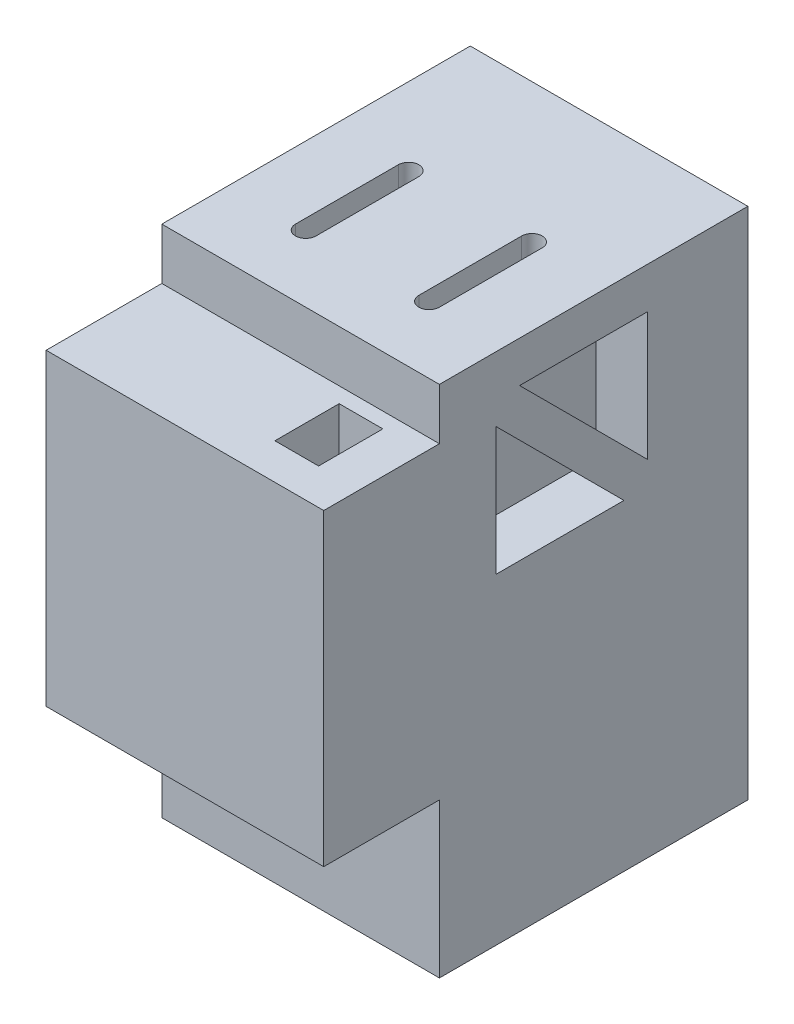
ISO-10303-21;
HEADER;
FILE_DESCRIPTION(('STEP AP214'),'2;1');
FILE_NAME('part.step','',(''),(''),'','','');
FILE_SCHEMA(('AUTOMOTIVE_DESIGN { 1 0 10303 214 1 1 1 1 }'));
ENDSEC;
DATA;
#1=APPLICATION_CONTEXT('core data for automotive mechanical design processes');
#2=APPLICATION_PROTOCOL_DEFINITION('international standard','automotive_design',2000,#1);
#3=PRODUCT_CONTEXT('',#1,'mechanical');
#4=PRODUCT('Part','Part','',(#3));
#5=PRODUCT_RELATED_PRODUCT_CATEGORY('part','',(#4));
#6=PRODUCT_DEFINITION_FORMATION('','',#4);
#7=PRODUCT_DEFINITION_CONTEXT('part definition',#1,'design');
#8=PRODUCT_DEFINITION('design','',#6,#7);
#9=PRODUCT_DEFINITION_SHAPE('','',#8);
#10=(LENGTH_UNIT() NAMED_UNIT(*) SI_UNIT(.MILLI.,.METRE.));
#11=(NAMED_UNIT(*) PLANE_ANGLE_UNIT() SI_UNIT($,.RADIAN.));
#12=(NAMED_UNIT(*) SI_UNIT($,.STERADIAN.) SOLID_ANGLE_UNIT());
#13=UNCERTAINTY_MEASURE_WITH_UNIT(LENGTH_MEASURE(1.E-05),#10,'distance_accuracy_value','');
#14=(GEOMETRIC_REPRESENTATION_CONTEXT(3) GLOBAL_UNCERTAINTY_ASSIGNED_CONTEXT((#13)) GLOBAL_UNIT_ASSIGNED_CONTEXT((#10,
#11,#12)) REPRESENTATION_CONTEXT('',''));
#15=CARTESIAN_POINT('',(0.,0.,0.));
#16=DIRECTION('',(0.,0.,1.));
#17=DIRECTION('',(1.,0.,0.));
#18=AXIS2_PLACEMENT_3D('',#15,#16,#17);
#19=CARTESIAN_POINT('',(0.,0.,60.));
#20=DIRECTION('',(0.,0.,1.));
#21=DIRECTION('',(1.,0.,0.));
#22=AXIS2_PLACEMENT_3D('',#19,#20,#21);
#23=PLANE('',#22);
#24=DIRECTION('',(-1.,0.,0.));
#25=VECTOR('',#24,1.);
#26=CARTESIAN_POINT('',(-54.,-10.,60.));
#27=LINE('',#26,#25);
#28=CARTESIAN_POINT('',(0.,-10.,60.));
#29=VERTEX_POINT('',#28);
#30=CARTESIAN_POINT('',(-54.,-10.,60.));
#31=VERTEX_POINT('',#30);
#32=EDGE_CURVE('E359',#29,#31,#27,.T.);
#33=ORIENTED_EDGE('',*,*,#32,.F.);
#34=DIRECTION('',(0.,1.,0.));
#35=VECTOR('',#34,1.);
#36=CARTESIAN_POINT('',(0.,0.,60.));
#37=LINE('',#36,#35);
#38=CARTESIAN_POINT('',(0.,0.,60.));
#39=VERTEX_POINT('',#38);
#40=EDGE_CURVE('E387',#29,#39,#37,.T.);
#41=ORIENTED_EDGE('',*,*,#40,.T.);
#42=DIRECTION('',(-1.,0.,0.));
#43=VECTOR('',#42,1.);
#44=CARTESIAN_POINT('',(-54.,0.,60.));
#45=LINE('',#44,#43);
#46=CARTESIAN_POINT('',(-54.,0.,60.));
#47=VERTEX_POINT('',#46);
#48=EDGE_CURVE('E390',#39,#47,#45,.T.);
#49=ORIENTED_EDGE('',*,*,#48,.T.);
#50=DIRECTION('',(0.,-1.,0.));
#51=VECTOR('',#50,1.);
#52=CARTESIAN_POINT('',(-54.,0.,60.));
#53=LINE('',#52,#51);
#54=EDGE_CURVE('E382',#47,#31,#53,.T.);
#55=ORIENTED_EDGE('',*,*,#54,.T.);
#56=EDGE_LOOP('',(#33,#41,#49,#55));
#57=FACE_BOUND('',#56,.T.);
#58=ADVANCED_FACE('F34',(#57),#23,.T.);
#59=CARTESIAN_POINT('',(-54.,0.,60.));
#60=DIRECTION('',(1.,0.,0.));
#61=DIRECTION('',(0.,1.,0.));
#62=AXIS2_PLACEMENT_3D('',#59,#60,#61);
#63=PLANE('',#62);
#64=DIRECTION('',(0.,-1.,0.));
#65=VECTOR('',#64,1.);
#66=CARTESIAN_POINT('',(-54.,0.,0.));
#67=LINE('',#66,#65);
#68=CARTESIAN_POINT('',(-54.,0.,0.));
#69=VERTEX_POINT('',#68);
#70=CARTESIAN_POINT('',(-54.,-100.,0.));
#71=VERTEX_POINT('',#70);
#72=EDGE_CURVE('E381',#69,#71,#67,.T.);
#73=ORIENTED_EDGE('',*,*,#72,.T.);
#74=DIRECTION('',(0.,0.,-1.));
#75=VECTOR('',#74,1.);
#76=CARTESIAN_POINT('',(-54.,-100.,60.));
#77=LINE('',#76,#75);
#78=CARTESIAN_POINT('',(-54.,-100.,60.));
#79=VERTEX_POINT('',#78);
#80=EDGE_CURVE('E11',#79,#71,#77,.T.);
#81=ORIENTED_EDGE('',*,*,#80,.F.);
#82=CARTESIAN_POINT('',(-54.,-70.,60.));
#83=VERTEX_POINT('',#82);
#84=EDGE_CURVE('E385',#83,#79,#53,.T.);
#85=ORIENTED_EDGE('',*,*,#84,.F.);
#86=DIRECTION('',(0.,0.,-1.));
#87=VECTOR('',#86,1.);
#88=CARTESIAN_POINT('',(-54.,-70.,82.5));
#89=LINE('',#88,#87);
#90=CARTESIAN_POINT('',(-54.,-70.,82.5));
#91=VERTEX_POINT('',#90);
#92=EDGE_CURVE('E378',#91,#83,#89,.T.);
#93=ORIENTED_EDGE('',*,*,#92,.F.);
#94=DIRECTION('',(0.,-1.,0.));
#95=VECTOR('',#94,1.);
#96=CARTESIAN_POINT('',(-54.,-70.,82.5));
#97=LINE('',#96,#95);
#98=CARTESIAN_POINT('',(-54.,-10.,82.5));
#99=VERTEX_POINT('',#98);
#100=EDGE_CURVE('E355',#99,#91,#97,.T.);
#101=ORIENTED_EDGE('',*,*,#100,.F.);
#102=DIRECTION('',(0.,0.,-1.));
#103=VECTOR('',#102,1.);
#104=CARTESIAN_POINT('',(-54.,-10.,82.5));
#105=LINE('',#104,#103);
#106=EDGE_CURVE('E365',#99,#31,#105,.T.);
#107=ORIENTED_EDGE('',*,*,#106,.T.);
#108=ORIENTED_EDGE('',*,*,#54,.F.);
#109=DIRECTION('',(0.,0.,-1.));
#110=VECTOR('',#109,1.);
#111=CARTESIAN_POINT('',(-54.,0.,60.));
#112=LINE('',#111,#110);
#113=EDGE_CURVE('E392',#47,#69,#112,.T.);
#114=ORIENTED_EDGE('',*,*,#113,.T.);
#115=EDGE_LOOP('',(#73,#81,#85,#93,#101,#107,#108,#114));
#116=FACE_BOUND('',#115,.T.);
#117=ADVANCED_FACE('F36',(#116),#63,.F.);
#118=CARTESIAN_POINT('',(-54.,-100.,60.));
#119=DIRECTION('',(0.,1.,0.));
#120=DIRECTION('',(0.,0.,1.));
#121=AXIS2_PLACEMENT_3D('',#118,#119,#120);
#122=PLANE('',#121);
#123=DIRECTION('',(1.,0.,0.));
#124=VECTOR('',#123,1.);
#125=CARTESIAN_POINT('',(-54.,-100.,0.));
#126=LINE('',#125,#124);
#127=CARTESIAN_POINT('',(0.,-100.,0.));
#128=VERTEX_POINT('',#127);
#129=EDGE_CURVE('E395',#71,#128,#126,.T.);
#130=ORIENTED_EDGE('',*,*,#129,.T.);
#131=DIRECTION('',(0.,0.,-1.));
#132=VECTOR('',#131,1.);
#133=CARTESIAN_POINT('',(0.,-100.,60.));
#134=LINE('',#133,#132);
#135=CARTESIAN_POINT('',(0.,-100.,60.));
#136=VERTEX_POINT('',#135);
#137=EDGE_CURVE('E42',#136,#128,#134,.T.);
#138=ORIENTED_EDGE('',*,*,#137,.F.);
#139=DIRECTION('',(1.,0.,0.));
#140=VECTOR('',#139,1.);
#141=CARTESIAN_POINT('',(-54.,-100.,60.));
#142=LINE('',#141,#140);
#143=EDGE_CURVE('E384',#79,#136,#142,.T.);
#144=ORIENTED_EDGE('',*,*,#143,.F.);
#145=ORIENTED_EDGE('',*,*,#80,.T.);
#146=EDGE_LOOP('',(#130,#138,#144,#145));
#147=FACE_BOUND('',#146,.T.);
#148=ADVANCED_FACE('F443',(#147),#122,.F.);
#149=CARTESIAN_POINT('',(0.,0.,60.));
#150=DIRECTION('',(-1.,0.,0.));
#151=DIRECTION('',(0.,-1.,0.));
#152=AXIS2_PLACEMENT_3D('',#149,#150,#151);
#153=PLANE('',#152);
#154=DIRECTION('',(0.,0.707106781186548,0.707106781186547));
#155=VECTOR('',#154,1.);
#156=CARTESIAN_POINT('',(0.,-37.5,24.0961940777126));
#157=LINE('',#156,#155);
#158=CARTESIAN_POINT('',(0.,-37.5,24.0961940777126));
#159=VERTEX_POINT('',#158);
#160=CARTESIAN_POINT('',(0.,-12.5961940777126,49.));
#161=VERTEX_POINT('',#160);
#162=EDGE_CURVE('E227',#159,#161,#157,.T.);
#163=ORIENTED_EDGE('',*,*,#162,.F.);
#164=DIRECTION('',(0.,0.,-1.));
#165=VECTOR('',#164,1.);
#166=CARTESIAN_POINT('',(0.,-37.5,49.));
#167=LINE('',#166,#165);
#168=CARTESIAN_POINT('',(0.,-37.5,49.));
#169=VERTEX_POINT('',#168);
#170=EDGE_CURVE('E49',#169,#159,#167,.T.);
#171=ORIENTED_EDGE('',*,*,#170,.F.);
#172=DIRECTION('',(0.,-1.,0.));
#173=VECTOR('',#172,1.);
#174=CARTESIAN_POINT('',(0.,-12.5961940777126,49.));
#175=LINE('',#174,#173);
#176=EDGE_CURVE('E224',#161,#169,#175,.T.);
#177=ORIENTED_EDGE('',*,*,#176,.F.);
#178=EDGE_LOOP('',(#163,#171,#177));
#179=FACE_BOUND('',#178,.T.);
#180=DIRECTION('',(0.,1.,0.));
#181=VECTOR('',#180,1.);
#182=CARTESIAN_POINT('',(0.,-8.,19.5));
#183=LINE('',#182,#181);
#184=CARTESIAN_POINT('',(0.,-32.9038059222874,19.5));
#185=VERTEX_POINT('',#184);
#186=CARTESIAN_POINT('',(0.,-8.,19.5));
#187=VERTEX_POINT('',#186);
#188=EDGE_CURVE('E248',#185,#187,#183,.T.);
#189=ORIENTED_EDGE('',*,*,#188,.F.);
#190=DIRECTION('',(0.,-0.707106781186548,-0.707106781186548));
#191=VECTOR('',#190,1.);
#192=CARTESIAN_POINT('',(0.,-32.9038059222874,19.5));
#193=LINE('',#192,#191);
#194=CARTESIAN_POINT('',(0.,-8.,44.4038059222874));
#195=VERTEX_POINT('',#194);
#196=EDGE_CURVE('E57',#195,#185,#193,.T.);
#197=ORIENTED_EDGE('',*,*,#196,.F.);
#198=DIRECTION('',(0.,0.,1.));
#199=VECTOR('',#198,1.);
#200=CARTESIAN_POINT('',(0.,-8.,44.4038059222874));
#201=LINE('',#200,#199);
#202=EDGE_CURVE('E240',#187,#195,#201,.T.);
#203=ORIENTED_EDGE('',*,*,#202,.F.);
#204=EDGE_LOOP('',(#189,#197,#203));
#205=FACE_BOUND('',#204,.T.);
#206=DIRECTION('',(0.,1.,0.));
#207=VECTOR('',#206,1.);
#208=CARTESIAN_POINT('',(0.,0.,0.));
#209=LINE('',#208,#207);
#210=CARTESIAN_POINT('',(0.,0.,0.));
#211=VERTEX_POINT('',#210);
#212=EDGE_CURVE('E397',#128,#211,#209,.T.);
#213=ORIENTED_EDGE('',*,*,#212,.T.);
#214=DIRECTION('',(0.,0.,-1.));
#215=VECTOR('',#214,1.);
#216=CARTESIAN_POINT('',(0.,0.,60.));
#217=LINE('',#216,#215);
#218=EDGE_CURVE('E403',#39,#211,#217,.T.);
#219=ORIENTED_EDGE('',*,*,#218,.F.);
#220=ORIENTED_EDGE('',*,*,#40,.F.);
#221=DIRECTION('',(0.,0.,-1.));
#222=VECTOR('',#221,1.);
#223=CARTESIAN_POINT('',(0.,-10.,82.5));
#224=LINE('',#223,#222);
#225=CARTESIAN_POINT('',(0.,-10.,82.5));
#226=VERTEX_POINT('',#225);
#227=EDGE_CURVE('E372',#226,#29,#224,.T.);
#228=ORIENTED_EDGE('',*,*,#227,.F.);
#229=DIRECTION('',(0.,1.,0.));
#230=VECTOR('',#229,1.);
#231=CARTESIAN_POINT('',(0.,-10.,82.5));
#232=LINE('',#231,#230);
#233=CARTESIAN_POINT('',(0.,-70.,82.5));
#234=VERTEX_POINT('',#233);
#235=EDGE_CURVE('E361',#234,#226,#232,.T.);
#236=ORIENTED_EDGE('',*,*,#235,.F.);
#237=DIRECTION('',(0.,0.,-1.));
#238=VECTOR('',#237,1.);
#239=CARTESIAN_POINT('',(0.,-70.,82.5));
#240=LINE('',#239,#238);
#241=CARTESIAN_POINT('',(0.,-70.,60.));
#242=VERTEX_POINT('',#241);
#243=EDGE_CURVE('E375',#234,#242,#240,.T.);
#244=ORIENTED_EDGE('',*,*,#243,.T.);
#245=EDGE_CURVE('E388',#136,#242,#37,.T.);
#246=ORIENTED_EDGE('',*,*,#245,.F.);
#247=ORIENTED_EDGE('',*,*,#137,.T.);
#248=EDGE_LOOP('',(#213,#219,#220,#228,#236,#244,#246,#247));
#249=FACE_BOUND('',#248,.T.);
#250=ADVANCED_FACE('F410',(#179,#205,#249),#153,.F.);
#251=CARTESIAN_POINT('',(-54.,0.,60.));
#252=DIRECTION('',(0.,-1.,0.));
#253=DIRECTION('',(0.,0.,-1.));
#254=AXIS2_PLACEMENT_3D('',#251,#252,#253);
#255=PLANE('',#254);
#256=DIRECTION('',(0.,0.,1.));
#257=VECTOR('',#256,1.);
#258=CARTESIAN_POINT('',(-41.,0.,27.));
#259=LINE('',#258,#257);
#260=CARTESIAN_POINT('',(-41.,0.,27.));
#261=VERTEX_POINT('',#260);
#262=CARTESIAN_POINT('',(-41.,0.,47.));
#263=VERTEX_POINT('',#262);
#264=EDGE_CURVE('E275',#261,#263,#259,.T.);
#265=ORIENTED_EDGE('',*,*,#264,.F.);
#266=CARTESIAN_POINT('',(-39.,0.,27.));
#267=DIRECTION('',(0.,1.,0.));
#268=DIRECTION('',(0.,0.,1.));
#269=AXIS2_PLACEMENT_3D('',#266,#267,#268);
#270=CIRCLE('',#269,2.);
#271=CARTESIAN_POINT('',(-37.,0.,27.));
#272=VERTEX_POINT('',#271);
#273=EDGE_CURVE('E273',#272,#261,#270,.T.);
#274=ORIENTED_EDGE('',*,*,#273,.F.);
#275=DIRECTION('',(0.,0.,-1.));
#276=VECTOR('',#275,1.);
#277=CARTESIAN_POINT('',(-37.,0.,27.));
#278=LINE('',#277,#276);
#279=CARTESIAN_POINT('',(-37.,0.,47.));
#280=VERTEX_POINT('',#279);
#281=EDGE_CURVE('E263',#280,#272,#278,.T.);
#282=ORIENTED_EDGE('',*,*,#281,.F.);
#283=CARTESIAN_POINT('',(-39.,0.,47.));
#284=DIRECTION('',(0.,1.,0.));
#285=DIRECTION('',(0.,0.,1.));
#286=AXIS2_PLACEMENT_3D('',#283,#284,#285);
#287=CIRCLE('',#286,2.00000000000001);
#288=EDGE_CURVE('E279',#263,#280,#287,.T.);
#289=ORIENTED_EDGE('',*,*,#288,.F.);
#290=EDGE_LOOP('',(#265,#274,#282,#289));
#291=FACE_BOUND('',#290,.T.);
#292=DIRECTION('',(0.,0.,1.));
#293=VECTOR('',#292,1.);
#294=CARTESIAN_POINT('',(-17.,0.,27.));
#295=LINE('',#294,#293);
#296=CARTESIAN_POINT('',(-17.,0.,27.));
#297=VERTEX_POINT('',#296);
#298=CARTESIAN_POINT('',(-17.,0.,47.));
#299=VERTEX_POINT('',#298);
#300=EDGE_CURVE('E308',#297,#299,#295,.T.);
#301=ORIENTED_EDGE('',*,*,#300,.F.);
#302=CARTESIAN_POINT('',(-15.,0.,27.));
#303=DIRECTION('',(0.,1.,0.));
#304=DIRECTION('',(0.,0.,-1.));
#305=AXIS2_PLACEMENT_3D('',#302,#303,#304);
#306=CIRCLE('',#305,2.);
#307=CARTESIAN_POINT('',(-13.,0.,27.));
#308=VERTEX_POINT('',#307);
#309=EDGE_CURVE('E255',#308,#297,#306,.T.);
#310=ORIENTED_EDGE('',*,*,#309,.F.);
#311=DIRECTION('',(0.,0.,-1.));
#312=VECTOR('',#311,1.);
#313=CARTESIAN_POINT('',(-13.,0.,27.));
#314=LINE('',#313,#312);
#315=CARTESIAN_POINT('',(-13.,0.,47.));
#316=VERTEX_POINT('',#315);
#317=EDGE_CURVE('E297',#316,#308,#314,.T.);
#318=ORIENTED_EDGE('',*,*,#317,.F.);
#319=CARTESIAN_POINT('',(-15.,0.,47.));
#320=DIRECTION('',(0.,1.,0.));
#321=DIRECTION('',(0.,0.,-1.));
#322=AXIS2_PLACEMENT_3D('',#319,#320,#321);
#323=CIRCLE('',#322,2.00000000000001);
#324=EDGE_CURVE('E311',#299,#316,#323,.T.);
#325=ORIENTED_EDGE('',*,*,#324,.F.);
#326=EDGE_LOOP('',(#301,#310,#318,#325));
#327=FACE_BOUND('',#326,.T.);
#328=DIRECTION('',(-1.,0.,0.));
#329=VECTOR('',#328,1.);
#330=CARTESIAN_POINT('',(-54.,0.,0.));
#331=LINE('',#330,#329);
#332=EDGE_CURVE('E399',#211,#69,#331,.T.);
#333=ORIENTED_EDGE('',*,*,#332,.T.);
#334=ORIENTED_EDGE('',*,*,#113,.F.);
#335=ORIENTED_EDGE('',*,*,#48,.F.);
#336=ORIENTED_EDGE('',*,*,#218,.T.);
#337=EDGE_LOOP('',(#333,#334,#335,#336));
#338=FACE_BOUND('',#337,.T.);
#339=ADVANCED_FACE('F420',(#291,#327,#338),#255,.F.);
#340=DIRECTION('',(1.,0.,0.));
#341=VECTOR('',#340,1.);
#342=CARTESIAN_POINT('',(0.,-70.,60.));
#343=LINE('',#342,#341);
#344=EDGE_CURVE('E348',#83,#242,#343,.T.);
#345=ORIENTED_EDGE('',*,*,#344,.F.);
#346=ORIENTED_EDGE('',*,*,#84,.T.);
#347=ORIENTED_EDGE('',*,*,#143,.T.);
#348=ORIENTED_EDGE('',*,*,#245,.T.);
#349=EDGE_LOOP('',(#345,#346,#347,#348));
#350=FACE_BOUND('',#349,.T.);
#351=ADVANCED_FACE('F442',(#350),#23,.T.);
#352=CARTESIAN_POINT('',(0.,0.,0.));
#353=DIRECTION('',(0.,0.,1.));
#354=DIRECTION('',(1.,0.,0.));
#355=AXIS2_PLACEMENT_3D('',#352,#353,#354);
#356=PLANE('',#355);
#357=ORIENTED_EDGE('',*,*,#72,.F.);
#358=ORIENTED_EDGE('',*,*,#332,.F.);
#359=ORIENTED_EDGE('',*,*,#212,.F.);
#360=ORIENTED_EDGE('',*,*,#129,.F.);
#361=EDGE_LOOP('',(#357,#358,#359,#360));
#362=FACE_BOUND('',#361,.T.);
#363=ADVANCED_FACE('F417',(#362),#356,.F.);
#364=CARTESIAN_POINT('',(0.,-70.,82.5));
#365=DIRECTION('',(0.,1.,0.));
#366=DIRECTION('',(0.,0.,1.));
#367=AXIS2_PLACEMENT_3D('',#364,#365,#366);
#368=PLANE('',#367);
#369=ORIENTED_EDGE('',*,*,#344,.T.);
#370=ORIENTED_EDGE('',*,*,#243,.F.);
#371=DIRECTION('',(1.,0.,0.));
#372=VECTOR('',#371,1.);
#373=CARTESIAN_POINT('',(0.,-70.,82.5));
#374=LINE('',#373,#372);
#375=EDGE_CURVE('E358',#91,#234,#374,.T.);
#376=ORIENTED_EDGE('',*,*,#375,.F.);
#377=ORIENTED_EDGE('',*,*,#92,.T.);
#378=EDGE_LOOP('',(#369,#370,#376,#377));
#379=FACE_BOUND('',#378,.T.);
#380=ADVANCED_FACE('F439',(#379),#368,.F.);
#381=CARTESIAN_POINT('',(-54.,-10.,82.5));
#382=DIRECTION('',(0.,-1.,0.));
#383=DIRECTION('',(0.,0.,-1.));
#384=AXIS2_PLACEMENT_3D('',#381,#382,#383);
#385=PLANE('',#384);
#386=DIRECTION('',(-1.,0.,0.));
#387=VECTOR('',#386,1.);
#388=CARTESIAN_POINT('',(-16.5,-10.,63.));
#389=LINE('',#388,#387);
#390=CARTESIAN_POINT('',(-7.99999999999999,-10.,63.));
#391=VERTEX_POINT('',#390);
#392=CARTESIAN_POINT('',(-16.5,-10.,63.));
#393=VERTEX_POINT('',#392);
#394=EDGE_CURVE('E338',#391,#393,#389,.T.);
#395=ORIENTED_EDGE('',*,*,#394,.F.);
#396=DIRECTION('',(0.,0.,-1.));
#397=VECTOR('',#396,1.);
#398=CARTESIAN_POINT('',(-7.99999999999999,-10.,75.5));
#399=LINE('',#398,#397);
#400=CARTESIAN_POINT('',(-7.99999999999999,-10.,75.5));
#401=VERTEX_POINT('',#400);
#402=EDGE_CURVE('E286',#401,#391,#399,.T.);
#403=ORIENTED_EDGE('',*,*,#402,.F.);
#404=DIRECTION('',(1.,0.,0.));
#405=VECTOR('',#404,1.);
#406=CARTESIAN_POINT('',(-16.5,-10.,75.5));
#407=LINE('',#406,#405);
#408=CARTESIAN_POINT('',(-16.5,-10.,75.5));
#409=VERTEX_POINT('',#408);
#410=EDGE_CURVE('E327',#409,#401,#407,.T.);
#411=ORIENTED_EDGE('',*,*,#410,.F.);
#412=DIRECTION('',(0.,0.,1.));
#413=VECTOR('',#412,1.);
#414=CARTESIAN_POINT('',(-16.5,-10.,75.5));
#415=LINE('',#414,#413);
#416=EDGE_CURVE('E341',#393,#409,#415,.T.);
#417=ORIENTED_EDGE('',*,*,#416,.F.);
#418=EDGE_LOOP('',(#395,#403,#411,#417));
#419=FACE_BOUND('',#418,.T.);
#420=ORIENTED_EDGE('',*,*,#32,.T.);
#421=ORIENTED_EDGE('',*,*,#106,.F.);
#422=DIRECTION('',(-1.,0.,0.));
#423=VECTOR('',#422,1.);
#424=CARTESIAN_POINT('',(-54.,-10.,82.5));
#425=LINE('',#424,#423);
#426=EDGE_CURVE('E363',#226,#99,#425,.T.);
#427=ORIENTED_EDGE('',*,*,#426,.F.);
#428=ORIENTED_EDGE('',*,*,#227,.T.);
#429=EDGE_LOOP('',(#420,#421,#427,#428));
#430=FACE_BOUND('',#429,.T.);
#431=ADVANCED_FACE('F430',(#419,#430),#385,.F.);
#432=CARTESIAN_POINT('',(0.,0.,82.5));
#433=DIRECTION('',(0.,0.,-1.));
#434=DIRECTION('',(-1.,0.,0.));
#435=AXIS2_PLACEMENT_3D('',#432,#433,#434);
#436=PLANE('',#435);
#437=ORIENTED_EDGE('',*,*,#100,.T.);
#438=ORIENTED_EDGE('',*,*,#375,.T.);
#439=ORIENTED_EDGE('',*,*,#235,.T.);
#440=ORIENTED_EDGE('',*,*,#426,.T.);
#441=EDGE_LOOP('',(#437,#438,#439,#440));
#442=FACE_BOUND('',#441,.T.);
#443=ADVANCED_FACE('F436',(#442),#436,.F.);
#444=CARTESIAN_POINT('',(-7.99999999999999,-32.5,75.5));
#445=DIRECTION('',(1.,0.,0.));
#446=DIRECTION('',(0.,0.,-1.));
#447=AXIS2_PLACEMENT_3D('',#444,#445,#446);
#448=PLANE('',#447);
#449=ORIENTED_EDGE('',*,*,#402,.T.);
#450=DIRECTION('',(0.,1.,0.));
#451=VECTOR('',#450,1.);
#452=CARTESIAN_POINT('',(-7.99999999999999,-32.5,63.));
#453=LINE('',#452,#451);
#454=CARTESIAN_POINT('',(-7.99999999999999,-32.5,63.));
#455=VERTEX_POINT('',#454);
#456=EDGE_CURVE('E336',#455,#391,#453,.T.);
#457=ORIENTED_EDGE('',*,*,#456,.F.);
#458=DIRECTION('',(0.,0.,-1.));
#459=VECTOR('',#458,1.);
#460=CARTESIAN_POINT('',(-7.99999999999999,-32.5,75.5));
#461=LINE('',#460,#459);
#462=CARTESIAN_POINT('',(-7.99999999999999,-32.5,75.5));
#463=VERTEX_POINT('',#462);
#464=EDGE_CURVE('E323',#463,#455,#461,.T.);
#465=ORIENTED_EDGE('',*,*,#464,.F.);
#466=DIRECTION('',(0.,1.,0.));
#467=VECTOR('',#466,1.);
#468=CARTESIAN_POINT('',(-7.99999999999999,-32.5,75.5));
#469=LINE('',#468,#467);
#470=EDGE_CURVE('E346',#463,#401,#469,.T.);
#471=ORIENTED_EDGE('',*,*,#470,.T.);
#472=EDGE_LOOP('',(#449,#457,#465,#471));
#473=FACE_BOUND('',#472,.T.);
#474=ADVANCED_FACE('F516',(#473),#448,.F.);
#475=CARTESIAN_POINT('',(-16.5,-32.5,75.5));
#476=DIRECTION('',(0.,0.,1.));
#477=DIRECTION('',(1.,0.,0.));
#478=AXIS2_PLACEMENT_3D('',#475,#476,#477);
#479=PLANE('',#478);
#480=ORIENTED_EDGE('',*,*,#410,.T.);
#481=ORIENTED_EDGE('',*,*,#470,.F.);
#482=DIRECTION('',(1.,0.,0.));
#483=VECTOR('',#482,1.);
#484=CARTESIAN_POINT('',(-16.5,-32.5,75.5));
#485=LINE('',#484,#483);
#486=CARTESIAN_POINT('',(-16.5,-32.5,75.5));
#487=VERTEX_POINT('',#486);
#488=EDGE_CURVE('E333',#487,#463,#485,.T.);
#489=ORIENTED_EDGE('',*,*,#488,.F.);
#490=DIRECTION('',(0.,1.,0.));
#491=VECTOR('',#490,1.);
#492=CARTESIAN_POINT('',(-16.5,-32.5,75.5));
#493=LINE('',#492,#491);
#494=EDGE_CURVE('E349',#487,#409,#493,.T.);
#495=ORIENTED_EDGE('',*,*,#494,.T.);
#496=EDGE_LOOP('',(#480,#481,#489,#495));
#497=FACE_BOUND('',#496,.T.);
#498=ADVANCED_FACE('F512',(#497),#479,.F.);
#499=CARTESIAN_POINT('',(-16.5,-32.5,75.5));
#500=DIRECTION('',(-1.,0.,0.));
#501=DIRECTION('',(0.,0.,1.));
#502=AXIS2_PLACEMENT_3D('',#499,#500,#501);
#503=PLANE('',#502);
#504=ORIENTED_EDGE('',*,*,#416,.T.);
#505=ORIENTED_EDGE('',*,*,#494,.F.);
#506=DIRECTION('',(0.,0.,1.));
#507=VECTOR('',#506,1.);
#508=CARTESIAN_POINT('',(-16.5,-32.5,75.5));
#509=LINE('',#508,#507);
#510=CARTESIAN_POINT('',(-16.5,-32.5,63.));
#511=VERTEX_POINT('',#510);
#512=EDGE_CURVE('E330',#511,#487,#509,.T.);
#513=ORIENTED_EDGE('',*,*,#512,.F.);
#514=DIRECTION('',(0.,1.,0.));
#515=VECTOR('',#514,1.);
#516=CARTESIAN_POINT('',(-16.5,-32.5,63.));
#517=LINE('',#516,#515);
#518=EDGE_CURVE('E351',#511,#393,#517,.T.);
#519=ORIENTED_EDGE('',*,*,#518,.T.);
#520=EDGE_LOOP('',(#504,#505,#513,#519));
#521=FACE_BOUND('',#520,.T.);
#522=ADVANCED_FACE('F515',(#521),#503,.F.);
#523=CARTESIAN_POINT('',(-16.5,-32.5,63.));
#524=DIRECTION('',(0.,0.,-1.));
#525=DIRECTION('',(-1.,0.,0.));
#526=AXIS2_PLACEMENT_3D('',#523,#524,#525);
#527=PLANE('',#526);
#528=ORIENTED_EDGE('',*,*,#394,.T.);
#529=ORIENTED_EDGE('',*,*,#518,.F.);
#530=DIRECTION('',(-1.,0.,0.));
#531=VECTOR('',#530,1.);
#532=CARTESIAN_POINT('',(-16.5,-32.5,63.));
#533=LINE('',#532,#531);
#534=EDGE_CURVE('E326',#455,#511,#533,.T.);
#535=ORIENTED_EDGE('',*,*,#534,.F.);
#536=ORIENTED_EDGE('',*,*,#456,.T.);
#537=EDGE_LOOP('',(#528,#529,#535,#536));
#538=FACE_BOUND('',#537,.T.);
#539=ADVANCED_FACE('F510',(#538),#527,.F.);
#540=CARTESIAN_POINT('',(0.,-32.5,0.));
#541=DIRECTION('',(0.,-1.,0.));
#542=DIRECTION('',(0.,0.,-1.));
#543=AXIS2_PLACEMENT_3D('',#540,#541,#542);
#544=PLANE('',#543);
#545=ORIENTED_EDGE('',*,*,#464,.T.);
#546=ORIENTED_EDGE('',*,*,#534,.T.);
#547=ORIENTED_EDGE('',*,*,#512,.T.);
#548=ORIENTED_EDGE('',*,*,#488,.T.);
#549=EDGE_LOOP('',(#545,#546,#547,#548));
#550=FACE_BOUND('',#549,.T.);
#551=ADVANCED_FACE('F507',(#550),#544,.F.);
#552=CARTESIAN_POINT('',(-15.,-10.,27.));
#553=DIRECTION('',(0.,1.,0.));
#554=DIRECTION('',(0.,0.,1.));
#555=AXIS2_PLACEMENT_3D('',#552,#553,#554);
#556=CYLINDRICAL_SURFACE('',#555,2.);
#557=ORIENTED_EDGE('',*,*,#309,.T.);
#558=DIRECTION('',(0.,1.,0.));
#559=VECTOR('',#558,1.);
#560=CARTESIAN_POINT('',(-17.,-10.,27.));
#561=LINE('',#560,#559);
#562=CARTESIAN_POINT('',(-17.,-10.,27.));
#563=VERTEX_POINT('',#562);
#564=EDGE_CURVE('E306',#563,#297,#561,.T.);
#565=ORIENTED_EDGE('',*,*,#564,.F.);
#566=CARTESIAN_POINT('',(-15.,-10.,27.));
#567=DIRECTION('',(0.,1.,0.));
#568=DIRECTION('',(0.,0.,-1.));
#569=AXIS2_PLACEMENT_3D('',#566,#567,#568);
#570=CIRCLE('',#569,2.);
#571=CARTESIAN_POINT('',(-13.,-10.,27.));
#572=VERTEX_POINT('',#571);
#573=EDGE_CURVE('E293',#572,#563,#570,.T.);
#574=ORIENTED_EDGE('',*,*,#573,.F.);
#575=DIRECTION('',(0.,1.,0.));
#576=VECTOR('',#575,1.);
#577=CARTESIAN_POINT('',(-13.,-10.,27.));
#578=LINE('',#577,#576);
#579=EDGE_CURVE('E276',#572,#308,#578,.T.);
#580=ORIENTED_EDGE('',*,*,#579,.T.);
#581=EDGE_LOOP('',(#557,#565,#574,#580));
#582=FACE_BOUND('',#581,.T.);
#583=ADVANCED_FACE('F480',(#582),#556,.F.);
#584=CARTESIAN_POINT('',(-13.,-10.,27.));
#585=DIRECTION('',(1.,0.,0.));
#586=DIRECTION('',(0.,0.,-1.));
#587=AXIS2_PLACEMENT_3D('',#584,#585,#586);
#588=PLANE('',#587);
#589=ORIENTED_EDGE('',*,*,#317,.T.);
#590=ORIENTED_EDGE('',*,*,#579,.F.);
#591=DIRECTION('',(0.,0.,-1.));
#592=VECTOR('',#591,1.);
#593=CARTESIAN_POINT('',(-13.,-10.,27.));
#594=LINE('',#593,#592);
#595=CARTESIAN_POINT('',(-13.,-10.,47.));
#596=VERTEX_POINT('',#595);
#597=EDGE_CURVE('E303',#596,#572,#594,.T.);
#598=ORIENTED_EDGE('',*,*,#597,.F.);
#599=DIRECTION('',(0.,1.,0.));
#600=VECTOR('',#599,1.);
#601=CARTESIAN_POINT('',(-13.,-10.,47.));
#602=LINE('',#601,#600);
#603=EDGE_CURVE('E317',#596,#316,#602,.T.);
#604=ORIENTED_EDGE('',*,*,#603,.T.);
#605=EDGE_LOOP('',(#589,#590,#598,#604));
#606=FACE_BOUND('',#605,.T.);
#607=ADVANCED_FACE('F483',(#606),#588,.F.);
#608=CARTESIAN_POINT('',(-15.,-10.,47.));
#609=DIRECTION('',(0.,1.,0.));
#610=DIRECTION('',(0.,0.,1.));
#611=AXIS2_PLACEMENT_3D('',#608,#609,#610);
#612=CYLINDRICAL_SURFACE('',#611,2.00000000000001);
#613=ORIENTED_EDGE('',*,*,#324,.T.);
#614=ORIENTED_EDGE('',*,*,#603,.F.);
#615=CARTESIAN_POINT('',(-15.,-10.,47.));
#616=DIRECTION('',(0.,1.,0.));
#617=DIRECTION('',(0.,0.,-1.));
#618=AXIS2_PLACEMENT_3D('',#615,#616,#617);
#619=CIRCLE('',#618,2.00000000000001);
#620=CARTESIAN_POINT('',(-17.,-10.,47.));
#621=VERTEX_POINT('',#620);
#622=EDGE_CURVE('E300',#621,#596,#619,.T.);
#623=ORIENTED_EDGE('',*,*,#622,.F.);
#624=DIRECTION('',(0.,1.,0.));
#625=VECTOR('',#624,1.);
#626=CARTESIAN_POINT('',(-17.,-10.,47.));
#627=LINE('',#626,#625);
#628=EDGE_CURVE('E319',#621,#299,#627,.T.);
#629=ORIENTED_EDGE('',*,*,#628,.T.);
#630=EDGE_LOOP('',(#613,#614,#623,#629));
#631=FACE_BOUND('',#630,.T.);
#632=ADVANCED_FACE('F485',(#631),#612,.F.);
#633=CARTESIAN_POINT('',(-17.,-10.,27.));
#634=DIRECTION('',(-1.,0.,0.));
#635=DIRECTION('',(0.,0.,1.));
#636=AXIS2_PLACEMENT_3D('',#633,#634,#635);
#637=PLANE('',#636);
#638=ORIENTED_EDGE('',*,*,#300,.T.);
#639=ORIENTED_EDGE('',*,*,#628,.F.);
#640=DIRECTION('',(0.,0.,1.));
#641=VECTOR('',#640,1.);
#642=CARTESIAN_POINT('',(-17.,-10.,27.));
#643=LINE('',#642,#641);
#644=EDGE_CURVE('E296',#563,#621,#643,.T.);
#645=ORIENTED_EDGE('',*,*,#644,.F.);
#646=ORIENTED_EDGE('',*,*,#564,.T.);
#647=EDGE_LOOP('',(#638,#639,#645,#646));
#648=FACE_BOUND('',#647,.T.);
#649=ADVANCED_FACE('F475',(#648),#637,.F.);
#650=CARTESIAN_POINT('',(-15.,-10.,27.));
#651=DIRECTION('',(0.,-1.,0.));
#652=DIRECTION('',(0.,0.,-1.));
#653=AXIS2_PLACEMENT_3D('',#650,#651,#652);
#654=PLANE('',#653);
#655=ORIENTED_EDGE('',*,*,#573,.T.);
#656=ORIENTED_EDGE('',*,*,#644,.T.);
#657=ORIENTED_EDGE('',*,*,#622,.T.);
#658=ORIENTED_EDGE('',*,*,#597,.T.);
#659=EDGE_LOOP('',(#655,#656,#657,#658));
#660=FACE_BOUND('',#659,.T.);
#661=ADVANCED_FACE('F487',(#660),#654,.F.);
#662=CARTESIAN_POINT('',(-39.,-10.,27.));
#663=DIRECTION('',(0.,1.,0.));
#664=DIRECTION('',(0.,0.,1.));
#665=AXIS2_PLACEMENT_3D('',#662,#663,#664);
#666=CYLINDRICAL_SURFACE('',#665,2.);
#667=ORIENTED_EDGE('',*,*,#273,.T.);
#668=DIRECTION('',(0.,1.,0.));
#669=VECTOR('',#668,1.);
#670=CARTESIAN_POINT('',(-41.,-10.,27.));
#671=LINE('',#670,#669);
#672=CARTESIAN_POINT('',(-41.,-10.,27.));
#673=VERTEX_POINT('',#672);
#674=EDGE_CURVE('E272',#673,#261,#671,.T.);
#675=ORIENTED_EDGE('',*,*,#674,.F.);
#676=CARTESIAN_POINT('',(-39.,-10.,27.));
#677=DIRECTION('',(0.,1.,0.));
#678=DIRECTION('',(0.,0.,1.));
#679=AXIS2_PLACEMENT_3D('',#676,#677,#678);
#680=CIRCLE('',#679,2.);
#681=CARTESIAN_POINT('',(-37.,-10.,27.));
#682=VERTEX_POINT('',#681);
#683=EDGE_CURVE('E259',#682,#673,#680,.T.);
#684=ORIENTED_EDGE('',*,*,#683,.F.);
#685=DIRECTION('',(0.,1.,0.));
#686=VECTOR('',#685,1.);
#687=CARTESIAN_POINT('',(-37.,-10.,27.));
#688=LINE('',#687,#686);
#689=EDGE_CURVE('E284',#682,#272,#688,.T.);
#690=ORIENTED_EDGE('',*,*,#689,.T.);
#691=EDGE_LOOP('',(#667,#675,#684,#690));
#692=FACE_BOUND('',#691,.T.);
#693=ADVANCED_FACE('F489',(#692),#666,.F.);
#694=CARTESIAN_POINT('',(-37.,-10.,27.));
#695=DIRECTION('',(1.,0.,0.));
#696=DIRECTION('',(0.,0.,-1.));
#697=AXIS2_PLACEMENT_3D('',#694,#695,#696);
#698=PLANE('',#697);
#699=ORIENTED_EDGE('',*,*,#281,.T.);
#700=ORIENTED_EDGE('',*,*,#689,.F.);
#701=DIRECTION('',(0.,0.,-1.));
#702=VECTOR('',#701,1.);
#703=CARTESIAN_POINT('',(-37.,-10.,27.));
#704=LINE('',#703,#702);
#705=CARTESIAN_POINT('',(-37.,-10.,47.));
#706=VERTEX_POINT('',#705);
#707=EDGE_CURVE('E269',#706,#682,#704,.T.);
#708=ORIENTED_EDGE('',*,*,#707,.F.);
#709=DIRECTION('',(0.,1.,0.));
#710=VECTOR('',#709,1.);
#711=CARTESIAN_POINT('',(-37.,-10.,47.));
#712=LINE('',#711,#710);
#713=EDGE_CURVE('E287',#706,#280,#712,.T.);
#714=ORIENTED_EDGE('',*,*,#713,.T.);
#715=EDGE_LOOP('',(#699,#700,#708,#714));
#716=FACE_BOUND('',#715,.T.);
#717=ADVANCED_FACE('F495',(#716),#698,.F.);
#718=CARTESIAN_POINT('',(-39.,-10.,47.));
#719=DIRECTION('',(0.,1.,0.));
#720=DIRECTION('',(0.,0.,1.));
#721=AXIS2_PLACEMENT_3D('',#718,#719,#720);
#722=CYLINDRICAL_SURFACE('',#721,2.00000000000001);
#723=ORIENTED_EDGE('',*,*,#288,.T.);
#724=ORIENTED_EDGE('',*,*,#713,.F.);
#725=CARTESIAN_POINT('',(-39.,-10.,47.));
#726=DIRECTION('',(0.,1.,0.));
#727=DIRECTION('',(0.,0.,1.));
#728=AXIS2_PLACEMENT_3D('',#725,#726,#727);
#729=CIRCLE('',#728,2.00000000000001);
#730=CARTESIAN_POINT('',(-41.,-10.,47.));
#731=VERTEX_POINT('',#730);
#732=EDGE_CURVE('E266',#731,#706,#729,.T.);
#733=ORIENTED_EDGE('',*,*,#732,.F.);
#734=DIRECTION('',(0.,1.,0.));
#735=VECTOR('',#734,1.);
#736=CARTESIAN_POINT('',(-41.,-10.,47.));
#737=LINE('',#736,#735);
#738=EDGE_CURVE('E289',#731,#263,#737,.T.);
#739=ORIENTED_EDGE('',*,*,#738,.T.);
#740=EDGE_LOOP('',(#723,#724,#733,#739));
#741=FACE_BOUND('',#740,.T.);
#742=ADVANCED_FACE('F599',(#741),#722,.F.);
#743=CARTESIAN_POINT('',(-41.,-10.,27.));
#744=DIRECTION('',(-1.,0.,0.));
#745=DIRECTION('',(0.,0.,1.));
#746=AXIS2_PLACEMENT_3D('',#743,#744,#745);
#747=PLANE('',#746);
#748=ORIENTED_EDGE('',*,*,#264,.T.);
#749=ORIENTED_EDGE('',*,*,#738,.F.);
#750=DIRECTION('',(0.,0.,1.));
#751=VECTOR('',#750,1.);
#752=CARTESIAN_POINT('',(-41.,-10.,27.));
#753=LINE('',#752,#751);
#754=EDGE_CURVE('E262',#673,#731,#753,.T.);
#755=ORIENTED_EDGE('',*,*,#754,.F.);
#756=ORIENTED_EDGE('',*,*,#674,.T.);
#757=EDGE_LOOP('',(#748,#749,#755,#756));
#758=FACE_BOUND('',#757,.T.);
#759=ADVANCED_FACE('F609',(#758),#747,.F.);
#760=CARTESIAN_POINT('',(-39.,-10.,27.));
#761=DIRECTION('',(0.,1.,0.));
#762=DIRECTION('',(0.,0.,1.));
#763=AXIS2_PLACEMENT_3D('',#760,#761,#762);
#764=PLANE('',#763);
#765=ORIENTED_EDGE('',*,*,#683,.T.);
#766=ORIENTED_EDGE('',*,*,#754,.T.);
#767=ORIENTED_EDGE('',*,*,#732,.T.);
#768=ORIENTED_EDGE('',*,*,#707,.T.);
#769=EDGE_LOOP('',(#765,#766,#767,#768));
#770=FACE_BOUND('',#769,.T.);
#771=ADVANCED_FACE('F619',(#770),#764,.T.);
#772=CARTESIAN_POINT('',(-10.,-32.9038059222874,19.5));
#773=DIRECTION('',(0.,-0.707106781186548,0.707106781186548));
#774=DIRECTION('',(0.,-0.707106781186548,-0.707106781186548));
#775=AXIS2_PLACEMENT_3D('',#772,#773,#774);
#776=PLANE('',#775);
#777=ORIENTED_EDGE('',*,*,#196,.T.);
#778=DIRECTION('',(1.,0.,0.));
#779=VECTOR('',#778,1.);
#780=CARTESIAN_POINT('',(-10.,-32.9038059222874,19.5));
#781=LINE('',#780,#779);
#782=CARTESIAN_POINT('',(-10.,-32.9038059222874,19.5));
#783=VERTEX_POINT('',#782);
#784=EDGE_CURVE('E246',#783,#185,#781,.T.);
#785=ORIENTED_EDGE('',*,*,#784,.F.);
#786=DIRECTION('',(0.,-0.707106781186548,-0.707106781186548));
#787=VECTOR('',#786,1.);
#788=CARTESIAN_POINT('',(-10.,-32.9038059222874,19.5));
#789=LINE('',#788,#787);
#790=CARTESIAN_POINT('',(-10.,-8.,44.4038059222874));
#791=VERTEX_POINT('',#790);
#792=EDGE_CURVE('E236',#791,#783,#789,.T.);
#793=ORIENTED_EDGE('',*,*,#792,.F.);
#794=DIRECTION('',(1.,0.,0.));
#795=VECTOR('',#794,1.);
#796=CARTESIAN_POINT('',(-10.,-8.,44.4038059222874));
#797=LINE('',#796,#795);
#798=EDGE_CURVE('E253',#791,#195,#797,.T.);
#799=ORIENTED_EDGE('',*,*,#798,.T.);
#800=EDGE_LOOP('',(#777,#785,#793,#799));
#801=FACE_BOUND('',#800,.T.);
#802=ADVANCED_FACE('F628',(#801),#776,.F.);
#803=CARTESIAN_POINT('',(-10.,-8.,44.4038059222874));
#804=DIRECTION('',(0.,1.,0.));
#805=DIRECTION('',(0.,0.,1.));
#806=AXIS2_PLACEMENT_3D('',#803,#804,#805);
#807=PLANE('',#806);
#808=ORIENTED_EDGE('',*,*,#202,.T.);
#809=ORIENTED_EDGE('',*,*,#798,.F.);
#810=DIRECTION('',(0.,0.,1.));
#811=VECTOR('',#810,1.);
#812=CARTESIAN_POINT('',(-10.,-8.,44.4038059222874));
#813=LINE('',#812,#811);
#814=CARTESIAN_POINT('',(-10.,-8.,19.5));
#815=VERTEX_POINT('',#814);
#816=EDGE_CURVE('E243',#815,#791,#813,.T.);
#817=ORIENTED_EDGE('',*,*,#816,.F.);
#818=DIRECTION('',(1.,0.,0.));
#819=VECTOR('',#818,1.);
#820=CARTESIAN_POINT('',(-10.,-8.,19.5));
#821=LINE('',#820,#819);
#822=EDGE_CURVE('E256',#815,#187,#821,.T.);
#823=ORIENTED_EDGE('',*,*,#822,.T.);
#824=EDGE_LOOP('',(#808,#809,#817,#823));
#825=FACE_BOUND('',#824,.T.);
#826=ADVANCED_FACE('F646',(#825),#807,.F.);
#827=CARTESIAN_POINT('',(-10.,-8.,19.5));
#828=DIRECTION('',(0.,0.,-1.));
#829=DIRECTION('',(-1.,0.,0.));
#830=AXIS2_PLACEMENT_3D('',#827,#828,#829);
#831=PLANE('',#830);
#832=ORIENTED_EDGE('',*,*,#188,.T.);
#833=ORIENTED_EDGE('',*,*,#822,.F.);
#834=DIRECTION('',(0.,1.,0.));
#835=VECTOR('',#834,1.);
#836=CARTESIAN_POINT('',(-10.,-8.,19.5));
#837=LINE('',#836,#835);
#838=EDGE_CURVE('E239',#783,#815,#837,.T.);
#839=ORIENTED_EDGE('',*,*,#838,.F.);
#840=ORIENTED_EDGE('',*,*,#784,.T.);
#841=EDGE_LOOP('',(#832,#833,#839,#840));
#842=FACE_BOUND('',#841,.T.);
#843=ADVANCED_FACE('F655',(#842),#831,.F.);
#844=CARTESIAN_POINT('',(-10.,0.,0.));
#845=DIRECTION('',(-1.,0.,0.));
#846=DIRECTION('',(0.,-1.,0.));
#847=AXIS2_PLACEMENT_3D('',#844,#845,#846);
#848=PLANE('',#847);
#849=ORIENTED_EDGE('',*,*,#792,.T.);
#850=ORIENTED_EDGE('',*,*,#838,.T.);
#851=ORIENTED_EDGE('',*,*,#816,.T.);
#852=EDGE_LOOP('',(#849,#850,#851));
#853=FACE_BOUND('',#852,.T.);
#854=ADVANCED_FACE('F665',(#853),#848,.F.);
#855=CARTESIAN_POINT('',(-9.99999999999999,-37.5,49.));
#856=DIRECTION('',(0.,-1.,0.));
#857=DIRECTION('',(1.,0.,0.));
#858=AXIS2_PLACEMENT_3D('',#855,#856,#857);
#859=PLANE('',#858);
#860=ORIENTED_EDGE('',*,*,#170,.T.);
#861=DIRECTION('',(1.,0.,0.));
#862=VECTOR('',#861,1.);
#863=CARTESIAN_POINT('',(-9.99999999999999,-37.5,24.0961940777126));
#864=LINE('',#863,#862);
#865=CARTESIAN_POINT('',(-9.99999999999999,-37.5,24.0961940777126));
#866=VERTEX_POINT('',#865);
#867=EDGE_CURVE('E205',#866,#159,#864,.T.);
#868=ORIENTED_EDGE('',*,*,#867,.F.);
#869=DIRECTION('',(0.,0.,-1.));
#870=VECTOR('',#869,1.);
#871=CARTESIAN_POINT('',(-9.99999999999999,-37.5,49.));
#872=LINE('',#871,#870);
#873=CARTESIAN_POINT('',(-9.99999999999999,-37.5,49.));
#874=VERTEX_POINT('',#873);
#875=EDGE_CURVE('E209',#874,#866,#872,.T.);
#876=ORIENTED_EDGE('',*,*,#875,.F.);
#877=DIRECTION('',(1.,0.,0.));
#878=VECTOR('',#877,1.);
#879=CARTESIAN_POINT('',(-9.99999999999999,-37.5,49.));
#880=LINE('',#879,#878);
#881=EDGE_CURVE('E233',#874,#169,#880,.T.);
#882=ORIENTED_EDGE('',*,*,#881,.T.);
#883=EDGE_LOOP('',(#860,#868,#876,#882));
#884=FACE_BOUND('',#883,.T.);
#885=ADVANCED_FACE('F207',(#884),#859,.F.);
#886=CARTESIAN_POINT('',(-10.,-12.5961940777126,49.));
#887=DIRECTION('',(0.,0.,1.));
#888=DIRECTION('',(1.,0.,0.));
#889=AXIS2_PLACEMENT_3D('',#886,#887,#888);
#890=PLANE('',#889);
#891=ORIENTED_EDGE('',*,*,#176,.T.);
#892=ORIENTED_EDGE('',*,*,#881,.F.);
#893=DIRECTION('',(0.,-1.,0.));
#894=VECTOR('',#893,1.);
#895=CARTESIAN_POINT('',(-10.,-12.5961940777126,49.));
#896=LINE('',#895,#894);
#897=CARTESIAN_POINT('',(-10.,-12.5961940777126,49.));
#898=VERTEX_POINT('',#897);
#899=EDGE_CURVE('E215',#898,#874,#896,.T.);
#900=ORIENTED_EDGE('',*,*,#899,.F.);
#901=DIRECTION('',(1.,0.,0.));
#902=VECTOR('',#901,1.);
#903=CARTESIAN_POINT('',(-10.,-12.5961940777126,49.));
#904=LINE('',#903,#902);
#905=EDGE_CURVE('E214',#898,#161,#904,.T.);
#906=ORIENTED_EDGE('',*,*,#905,.T.);
#907=EDGE_LOOP('',(#891,#892,#900,#906));
#908=FACE_BOUND('',#907,.T.);
#909=ADVANCED_FACE('F684',(#908),#890,.F.);
#910=CARTESIAN_POINT('',(-9.99999999999999,-37.5,24.0961940777126));
#911=DIRECTION('',(0.,0.707106781186547,-0.707106781186548));
#912=DIRECTION('',(0.,0.707106781186548,0.707106781186547));
#913=AXIS2_PLACEMENT_3D('',#910,#911,#912);
#914=PLANE('',#913);
#915=ORIENTED_EDGE('',*,*,#162,.T.);
#916=ORIENTED_EDGE('',*,*,#905,.F.);
#917=DIRECTION('',(0.,0.707106781186548,0.707106781186547));
#918=VECTOR('',#917,1.);
#919=CARTESIAN_POINT('',(-9.99999999999999,-37.5,24.0961940777126));
#920=LINE('',#919,#918);
#921=EDGE_CURVE('E218',#866,#898,#920,.T.);
#922=ORIENTED_EDGE('',*,*,#921,.F.);
#923=ORIENTED_EDGE('',*,*,#867,.T.);
#924=EDGE_LOOP('',(#915,#916,#922,#923));
#925=FACE_BOUND('',#924,.T.);
#926=ADVANCED_FACE('F219',(#925),#914,.F.);
#927=CARTESIAN_POINT('',(-10.,0.,0.));
#928=DIRECTION('',(-1.,0.,0.));
#929=DIRECTION('',(0.,-1.,0.));
#930=AXIS2_PLACEMENT_3D('',#927,#928,#929);
#931=PLANE('',#930);
#932=ORIENTED_EDGE('',*,*,#875,.T.);
#933=ORIENTED_EDGE('',*,*,#921,.T.);
#934=ORIENTED_EDGE('',*,*,#899,.T.);
#935=EDGE_LOOP('',(#932,#933,#934));
#936=FACE_BOUND('',#935,.T.);
#937=ADVANCED_FACE('F223',(#936),#931,.F.);
#938=CLOSED_SHELL('',(#58,#117,#148,#250,#339,#351,#363,#380,#431,#443,#474,#498,#522,#539,#551,
#583,#607,#632,#649,#661,#693,#717,#742,#759,#771,#802,#826,#843,#854,#885,#909,#926,#937));
#939=MANIFOLD_SOLID_BREP('B2',#938);
#940=ADVANCED_BREP_SHAPE_REPRESENTATION('',(#18,#939),#14);
#941=SHAPE_DEFINITION_REPRESENTATION(#9,#940);
ENDSEC;
END-ISO-10303-21;
